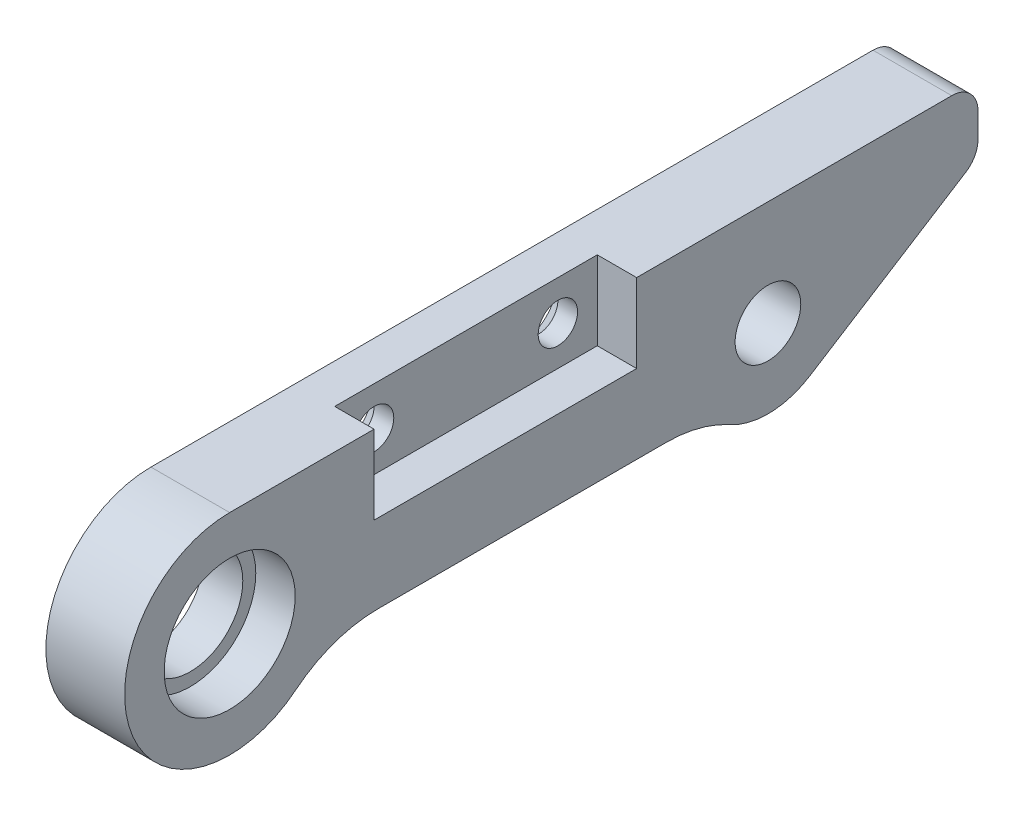
ISO-10303-21;
HEADER;
FILE_DESCRIPTION(('STEP AP214'),'2;1');
FILE_NAME('part.step','',(''),(''),'','','');
FILE_SCHEMA(('AUTOMOTIVE_DESIGN { 1 0 10303 214 1 1 1 1 }'));
ENDSEC;
DATA;
#1=APPLICATION_CONTEXT('core data for automotive mechanical design processes');
#2=APPLICATION_PROTOCOL_DEFINITION('international standard','automotive_design',2000,#1);
#3=PRODUCT_CONTEXT('',#1,'mechanical');
#4=PRODUCT('Part','Part','',(#3));
#5=PRODUCT_RELATED_PRODUCT_CATEGORY('part','',(#4));
#6=PRODUCT_DEFINITION_FORMATION('','',#4);
#7=PRODUCT_DEFINITION_CONTEXT('part definition',#1,'design');
#8=PRODUCT_DEFINITION('design','',#6,#7);
#9=PRODUCT_DEFINITION_SHAPE('','',#8);
#10=(LENGTH_UNIT() NAMED_UNIT(*) SI_UNIT(.MILLI.,.METRE.));
#11=(NAMED_UNIT(*) PLANE_ANGLE_UNIT() SI_UNIT($,.RADIAN.));
#12=(NAMED_UNIT(*) SI_UNIT($,.STERADIAN.) SOLID_ANGLE_UNIT());
#13=UNCERTAINTY_MEASURE_WITH_UNIT(LENGTH_MEASURE(1.E-05),#10,'distance_accuracy_value','');
#14=(GEOMETRIC_REPRESENTATION_CONTEXT(3) GLOBAL_UNCERTAINTY_ASSIGNED_CONTEXT((#13)) GLOBAL_UNIT_ASSIGNED_CONTEXT((#10,
#11,#12)) REPRESENTATION_CONTEXT('',''));
#15=CARTESIAN_POINT('',(0.,0.,0.));
#16=DIRECTION('',(0.,0.,1.));
#17=DIRECTION('',(1.,0.,0.));
#18=AXIS2_PLACEMENT_3D('',#15,#16,#17);
#19=CARTESIAN_POINT('',(6.,42.,-9.));
#20=DIRECTION('',(-1.,0.,0.));
#21=DIRECTION('',(0.,0.,1.));
#22=AXIS2_PLACEMENT_3D('',#19,#20,#21);
#23=CYLINDRICAL_SURFACE('',#22,4.);
#24=CARTESIAN_POINT('',(0.,42.,-9.));
#25=DIRECTION('',(1.,0.,0.));
#26=DIRECTION('',(0.,0.,-1.));
#27=AXIS2_PLACEMENT_3D('',#24,#25,#26);
#28=CIRCLE('',#27,4.);
#29=CARTESIAN_POINT('',(0.,42.,-13.));
#30=VERTEX_POINT('',#29);
#31=EDGE_CURVE('E180',#30,#30,#28,.T.);
#32=ORIENTED_EDGE('',*,*,#31,.F.);
#33=EDGE_LOOP('',(#32));
#34=FACE_BOUND('',#33,.T.);
#35=CARTESIAN_POINT('',(3.,42.,-9.));
#36=DIRECTION('',(1.,0.,0.));
#37=DIRECTION('',(0.,0.,-1.));
#38=AXIS2_PLACEMENT_3D('',#35,#36,#37);
#39=CIRCLE('',#38,4.);
#40=CARTESIAN_POINT('',(3.,42.,-13.));
#41=VERTEX_POINT('',#40);
#42=EDGE_CURVE('E192',#41,#41,#39,.T.);
#43=ORIENTED_EDGE('',*,*,#42,.T.);
#44=EDGE_LOOP('',(#43));
#45=FACE_BOUND('',#44,.T.);
#46=ADVANCED_FACE('F34',(#34,#45),#23,.F.);
#47=CARTESIAN_POINT('',(6.,42.,-9.));
#48=DIRECTION('',(1.,0.,0.));
#49=DIRECTION('',(0.,0.,-1.));
#50=AXIS2_PLACEMENT_3D('',#47,#48,#49);
#51=PLANE('',#50);
#52=CARTESIAN_POINT('',(6.,42.,-9.));
#53=DIRECTION('',(1.,0.,0.));
#54=DIRECTION('',(0.,0.,-1.));
#55=AXIS2_PLACEMENT_3D('',#52,#53,#54);
#56=CIRCLE('',#55,8.);
#57=CARTESIAN_POINT('',(6.,50.,-9.));
#58=VERTEX_POINT('',#57);
#59=CARTESIAN_POINT('',(6.,35.7777777777778,-14.0283148884377));
#60=VERTEX_POINT('',#59);
#61=EDGE_CURVE('E165',#58,#60,#56,.T.);
#62=ORIENTED_EDGE('',*,*,#61,.T.);
#63=CARTESIAN_POINT('',(6.,28.,-20.3137084989848));
#64=DIRECTION('',(1.,0.,0.));
#65=DIRECTION('',(0.,0.,1.));
#66=AXIS2_PLACEMENT_3D('',#63,#64,#65);
#67=CIRCLE('',#66,10.);
#68=CARTESIAN_POINT('',(6.,38.,-20.3137084989848));
#69=VERTEX_POINT('',#68);
#70=EDGE_CURVE('E376',#69,#60,#67,.T.);
#71=ORIENTED_EDGE('',*,*,#70,.F.);
#72=DIRECTION('',(0.,0.,1.));
#73=VECTOR('',#72,1.);
#74=CARTESIAN_POINT('',(6.,38.,-20.3137084989848));
#75=LINE('',#74,#73);
#76=CARTESIAN_POINT('',(6.,38.,-42.2540333075852));
#77=VERTEX_POINT('',#76);
#78=EDGE_CURVE('E384',#77,#69,#75,.T.);
#79=ORIENTED_EDGE('',*,*,#78,.F.);
#80=CARTESIAN_POINT('',(6.,28.,-42.2540333075852));
#81=DIRECTION('',(1.,0.,0.));
#82=DIRECTION('',(0.,0.,1.));
#83=AXIS2_PLACEMENT_3D('',#80,#81,#82);
#84=CIRCLE('',#83,10.);
#85=CARTESIAN_POINT('',(6.,36.75,-47.0952624903444));
#86=VERTEX_POINT('',#85);
#87=EDGE_CURVE('E157',#86,#77,#84,.T.);
#88=ORIENTED_EDGE('',*,*,#87,.F.);
#89=CARTESIAN_POINT('',(6.,42.,-50.));
#90=DIRECTION('',(-1.,0.,0.));
#91=DIRECTION('',(0.,0.,-1.));
#92=AXIS2_PLACEMENT_3D('',#89,#90,#91);
#93=CIRCLE('',#92,6.);
#94=CARTESIAN_POINT('',(6.,36.9254958066397,-53.2014695362551));
#95=VERTEX_POINT('',#94);
#96=EDGE_CURVE('E142',#95,#86,#93,.T.);
#97=ORIENTED_EDGE('',*,*,#96,.F.);
#98=DIRECTION('',(0.,0.533578256042508,-0.845750698893377));
#99=VECTOR('',#98,1.);
#100=CARTESIAN_POINT('',(6.,34.,-48.5643987878584));
#101=LINE('',#100,#99);
#102=CARTESIAN_POINT('',(6.,44.411475506797,-65.067156512085));
#103=VERTEX_POINT('',#102);
#104=EDGE_CURVE('E153',#95,#103,#101,.T.);
#105=ORIENTED_EDGE('',*,*,#104,.T.);
#106=CARTESIAN_POINT('',(6.,46.1029769045838,-64.));
#107=DIRECTION('',(1.,0.,0.));
#108=DIRECTION('',(0.,0.,-1.));
#109=AXIS2_PLACEMENT_3D('',#106,#107,#108);
#110=CIRCLE('',#109,2.);
#111=CARTESIAN_POINT('',(6.,46.1029769045838,-66.));
#112=VERTEX_POINT('',#111);
#113=EDGE_CURVE('E209',#103,#112,#110,.T.);
#114=ORIENTED_EDGE('',*,*,#113,.T.);
#115=DIRECTION('',(0.,1.,0.));
#116=VECTOR('',#115,1.);
#117=CARTESIAN_POINT('',(6.,50.,-66.));
#118=LINE('',#117,#116);
#119=CARTESIAN_POINT('',(6.,48.,-66.));
#120=VERTEX_POINT('',#119);
#121=EDGE_CURVE('E164',#112,#120,#118,.T.);
#122=ORIENTED_EDGE('',*,*,#121,.T.);
#123=CARTESIAN_POINT('',(6.,48.,-64.));
#124=DIRECTION('',(1.,0.,0.));
#125=DIRECTION('',(0.,0.,-1.));
#126=AXIS2_PLACEMENT_3D('',#123,#124,#125);
#127=CIRCLE('',#126,2.);
#128=CARTESIAN_POINT('',(6.,50.,-64.));
#129=VERTEX_POINT('',#128);
#130=EDGE_CURVE('E207',#120,#129,#127,.T.);
#131=ORIENTED_EDGE('',*,*,#130,.T.);
#132=DIRECTION('',(0.,0.,1.));
#133=VECTOR('',#132,1.);
#134=CARTESIAN_POINT('',(6.,50.,-9.));
#135=LINE('',#134,#133);
#136=CARTESIAN_POINT('',(6.,50.,-40.));
#137=VERTEX_POINT('',#136);
#138=EDGE_CURVE('E174',#129,#137,#135,.T.);
#139=ORIENTED_EDGE('',*,*,#138,.T.);
#140=DIRECTION('',(0.,1.,0.));
#141=VECTOR('',#140,1.);
#142=CARTESIAN_POINT('',(6.,44.,-40.));
#143=LINE('',#142,#141);
#144=CARTESIAN_POINT('',(6.,44.,-40.));
#145=VERTEX_POINT('',#144);
#146=EDGE_CURVE('E357',#145,#137,#143,.T.);
#147=ORIENTED_EDGE('',*,*,#146,.F.);
#148=DIRECTION('',(0.,0.,-1.));
#149=VECTOR('',#148,1.);
#150=CARTESIAN_POINT('',(6.,44.,-20.));
#151=LINE('',#150,#149);
#152=CARTESIAN_POINT('',(6.,44.,-20.));
#153=VERTEX_POINT('',#152);
#154=EDGE_CURVE('E346',#153,#145,#151,.T.);
#155=ORIENTED_EDGE('',*,*,#154,.F.);
#156=DIRECTION('',(0.,-1.,0.));
#157=VECTOR('',#156,1.);
#158=CARTESIAN_POINT('',(6.,44.,-20.));
#159=LINE('',#158,#157);
#160=CARTESIAN_POINT('',(6.,50.,-20.));
#161=VERTEX_POINT('',#160);
#162=EDGE_CURVE('E342',#161,#153,#159,.T.);
#163=ORIENTED_EDGE('',*,*,#162,.F.);
#164=EDGE_CURVE('E168',#161,#58,#135,.T.);
#165=ORIENTED_EDGE('',*,*,#164,.T.);
#166=EDGE_LOOP('',(#62,#71,#79,#88,#97,#105,#114,#122,#131,#139,#147,#155,#163,#165));
#167=FACE_BOUND('',#166,.T.);
#168=CARTESIAN_POINT('',(6.,42.,-9.));
#169=DIRECTION('',(1.,0.,0.));
#170=DIRECTION('',(0.,0.,-1.));
#171=AXIS2_PLACEMENT_3D('',#168,#169,#170);
#172=CIRCLE('',#171,4.99);
#173=CARTESIAN_POINT('',(6.,42.,-13.99));
#174=VERTEX_POINT('',#173);
#175=EDGE_CURVE('E254',#174,#174,#172,.T.);
#176=ORIENTED_EDGE('',*,*,#175,.F.);
#177=EDGE_LOOP('',(#176));
#178=FACE_BOUND('',#177,.T.);
#179=CARTESIAN_POINT('',(6.,42.,-50.));
#180=DIRECTION('',(1.,0.,0.));
#181=DIRECTION('',(0.,0.,-1.));
#182=AXIS2_PLACEMENT_3D('',#179,#180,#181);
#183=CIRCLE('',#182,2.5);
#184=CARTESIAN_POINT('',(6.,42.,-52.5));
#185=VERTEX_POINT('',#184);
#186=EDGE_CURVE('E265',#185,#185,#183,.T.);
#187=ORIENTED_EDGE('',*,*,#186,.F.);
#188=EDGE_LOOP('',(#187));
#189=FACE_BOUND('',#188,.T.);
#190=ADVANCED_FACE('F151',(#167,#178,#189),#51,.T.);
#191=CARTESIAN_POINT('',(0.,42.,-9.));
#192=DIRECTION('',(1.,0.,0.));
#193=DIRECTION('',(0.,0.,-1.));
#194=AXIS2_PLACEMENT_3D('',#191,#192,#193);
#195=PLANE('',#194);
#196=ORIENTED_EDGE('',*,*,#31,.T.);
#197=EDGE_LOOP('',(#196));
#198=FACE_BOUND('',#197,.T.);
#199=DIRECTION('',(0.,0.,1.));
#200=VECTOR('',#199,1.);
#201=CARTESIAN_POINT('',(0.,50.,-9.));
#202=LINE('',#201,#200);
#203=CARTESIAN_POINT('',(0.,50.,-23.));
#204=VERTEX_POINT('',#203);
#205=CARTESIAN_POINT('',(0.,50.,-9.));
#206=VERTEX_POINT('',#205);
#207=EDGE_CURVE('E185',#204,#206,#202,.T.);
#208=ORIENTED_EDGE('',*,*,#207,.F.);
#209=CARTESIAN_POINT('',(0.,47.,-23.));
#210=DIRECTION('',(1.,0.,0.));
#211=DIRECTION('',(0.,0.,-1.));
#212=AXIS2_PLACEMENT_3D('',#209,#210,#211);
#213=CIRCLE('',#212,3.00000000000007);
#214=EDGE_CURVE('E42',#204,#204,#213,.T.);
#215=ORIENTED_EDGE('',*,*,#214,.T.);
#216=CARTESIAN_POINT('',(0.,50.,-37.));
#217=VERTEX_POINT('',#216);
#218=EDGE_CURVE('E188',#217,#204,#202,.T.);
#219=ORIENTED_EDGE('',*,*,#218,.F.);
#220=CARTESIAN_POINT('',(0.,47.,-37.));
#221=DIRECTION('',(1.,0.,0.));
#222=DIRECTION('',(0.,0.,-1.));
#223=AXIS2_PLACEMENT_3D('',#220,#221,#222);
#224=CIRCLE('',#223,3.00000000000007);
#225=EDGE_CURVE('E51',#217,#217,#224,.T.);
#226=ORIENTED_EDGE('',*,*,#225,.T.);
#227=CARTESIAN_POINT('',(0.,50.,-64.));
#228=VERTEX_POINT('',#227);
#229=EDGE_CURVE('E170',#228,#217,#202,.T.);
#230=ORIENTED_EDGE('',*,*,#229,.F.);
#231=CARTESIAN_POINT('',(0.,48.,-64.));
#232=DIRECTION('',(1.,0.,0.));
#233=DIRECTION('',(0.,0.,-1.));
#234=AXIS2_PLACEMENT_3D('',#231,#232,#233);
#235=CIRCLE('',#234,2.);
#236=CARTESIAN_POINT('',(0.,48.,-66.));
#237=VERTEX_POINT('',#236);
#238=EDGE_CURVE('E201',#228,#237,#235,.F.);
#239=ORIENTED_EDGE('',*,*,#238,.T.);
#240=DIRECTION('',(0.,1.,0.));
#241=VECTOR('',#240,1.);
#242=CARTESIAN_POINT('',(0.,50.,-66.));
#243=LINE('',#242,#241);
#244=CARTESIAN_POINT('',(0.,46.1029769045838,-66.));
#245=VERTEX_POINT('',#244);
#246=EDGE_CURVE('E182',#245,#237,#243,.T.);
#247=ORIENTED_EDGE('',*,*,#246,.F.);
#248=CARTESIAN_POINT('',(0.,46.1029769045838,-64.));
#249=DIRECTION('',(1.,0.,0.));
#250=DIRECTION('',(0.,0.,-1.));
#251=AXIS2_PLACEMENT_3D('',#248,#249,#250);
#252=CIRCLE('',#251,2.);
#253=CARTESIAN_POINT('',(0.,44.411475506797,-65.067156512085));
#254=VERTEX_POINT('',#253);
#255=EDGE_CURVE('E203',#245,#254,#252,.F.);
#256=ORIENTED_EDGE('',*,*,#255,.T.);
#257=DIRECTION('',(0.,0.533578256042508,-0.845750698893377));
#258=VECTOR('',#257,1.);
#259=CARTESIAN_POINT('',(0.,34.,-48.5643987878584));
#260=LINE('',#259,#258);
#261=CARTESIAN_POINT('',(0.,36.9254958066397,-53.2014695362551));
#262=VERTEX_POINT('',#261);
#263=EDGE_CURVE('E179',#262,#254,#260,.T.);
#264=ORIENTED_EDGE('',*,*,#263,.F.);
#265=CARTESIAN_POINT('',(0.,42.,-50.));
#266=DIRECTION('',(1.,0.,0.));
#267=DIRECTION('',(0.,0.,-1.));
#268=AXIS2_PLACEMENT_3D('',#265,#266,#267);
#269=CIRCLE('',#268,6.);
#270=CARTESIAN_POINT('',(0.,36.75,-47.0952624903444));
#271=VERTEX_POINT('',#270);
#272=EDGE_CURVE('E145',#271,#262,#269,.T.);
#273=ORIENTED_EDGE('',*,*,#272,.F.);
#274=CARTESIAN_POINT('',(0.,28.,-42.2540333075852));
#275=DIRECTION('',(1.,0.,0.));
#276=DIRECTION('',(0.,0.,-1.));
#277=AXIS2_PLACEMENT_3D('',#274,#275,#276);
#278=CIRCLE('',#277,10.);
#279=CARTESIAN_POINT('',(0.,38.,-42.2540333075852));
#280=VERTEX_POINT('',#279);
#281=EDGE_CURVE('E401',#280,#271,#278,.F.);
#282=ORIENTED_EDGE('',*,*,#281,.F.);
#283=DIRECTION('',(0.,0.,-1.));
#284=VECTOR('',#283,1.);
#285=CARTESIAN_POINT('',(0.,38.,-20.3137084989848));
#286=LINE('',#285,#284);
#287=CARTESIAN_POINT('',(0.,38.,-20.3137084989848));
#288=VERTEX_POINT('',#287);
#289=EDGE_CURVE('E395',#288,#280,#286,.T.);
#290=ORIENTED_EDGE('',*,*,#289,.F.);
#291=CARTESIAN_POINT('',(0.,28.,-20.3137084989848));
#292=DIRECTION('',(1.,0.,0.));
#293=DIRECTION('',(0.,0.,-1.));
#294=AXIS2_PLACEMENT_3D('',#291,#292,#293);
#295=CIRCLE('',#294,10.);
#296=CARTESIAN_POINT('',(0.,35.7777777777778,-14.0283148884377));
#297=VERTEX_POINT('',#296);
#298=EDGE_CURVE('E158',#297,#288,#295,.F.);
#299=ORIENTED_EDGE('',*,*,#298,.F.);
#300=CARTESIAN_POINT('',(0.,42.,-9.));
#301=DIRECTION('',(1.,0.,0.));
#302=DIRECTION('',(0.,0.,-1.));
#303=AXIS2_PLACEMENT_3D('',#300,#301,#302);
#304=CIRCLE('',#303,8.);
#305=EDGE_CURVE('E177',#206,#297,#304,.T.);
#306=ORIENTED_EDGE('',*,*,#305,.F.);
#307=EDGE_LOOP('',(#208,#215,#219,#226,#230,#239,#247,#256,#264,#273,#282,#290,#299,#306));
#308=FACE_BOUND('',#307,.T.);
#309=CARTESIAN_POINT('',(0.,42.,-50.));
#310=DIRECTION('',(1.,0.,0.));
#311=DIRECTION('',(0.,0.,-1.));
#312=AXIS2_PLACEMENT_3D('',#309,#310,#311);
#313=CIRCLE('',#312,2.5);
#314=CARTESIAN_POINT('',(0.,42.,-52.5));
#315=VERTEX_POINT('',#314);
#316=EDGE_CURVE('E195',#315,#315,#313,.T.);
#317=ORIENTED_EDGE('',*,*,#316,.T.);
#318=EDGE_LOOP('',(#317));
#319=FACE_BOUND('',#318,.T.);
#320=ADVANCED_FACE('F220',(#198,#308,#319),#195,.F.);
#321=CARTESIAN_POINT('',(6.,42.,-9.));
#322=DIRECTION('',(-1.,0.,0.));
#323=DIRECTION('',(0.,0.,1.));
#324=AXIS2_PLACEMENT_3D('',#321,#322,#323);
#325=CYLINDRICAL_SURFACE('',#324,8.);
#326=ORIENTED_EDGE('',*,*,#305,.T.);
#327=DIRECTION('',(1.,0.,0.));
#328=VECTOR('',#327,1.);
#329=CARTESIAN_POINT('',(-0.00100000000000013,35.7777777777778,-14.0283148884377));
#330=LINE('',#329,#328);
#331=EDGE_CURVE('E349',#297,#60,#330,.T.);
#332=ORIENTED_EDGE('',*,*,#331,.T.);
#333=ORIENTED_EDGE('',*,*,#61,.F.);
#334=DIRECTION('',(-1.,0.,0.));
#335=VECTOR('',#334,1.);
#336=CARTESIAN_POINT('',(6.,50.,-9.));
#337=LINE('',#336,#335);
#338=EDGE_CURVE('E176',#58,#206,#337,.T.);
#339=ORIENTED_EDGE('',*,*,#338,.T.);
#340=EDGE_LOOP('',(#326,#332,#333,#339));
#341=FACE_BOUND('',#340,.T.);
#342=ADVANCED_FACE('F301',(#341),#325,.T.);
#343=CARTESIAN_POINT('',(6.,34.,-48.5643987878584));
#344=DIRECTION('',(0.,0.845750698893377,0.533578256042508));
#345=DIRECTION('',(0.,-0.533578256042508,0.845750698893377));
#346=AXIS2_PLACEMENT_3D('',#343,#344,#345);
#347=PLANE('',#346);
#348=ORIENTED_EDGE('',*,*,#104,.F.);
#349=DIRECTION('',(1.,0.,0.));
#350=VECTOR('',#349,1.);
#351=CARTESIAN_POINT('',(-0.00100000000000013,36.9254958066397,-53.2014695362551));
#352=LINE('',#351,#350);
#353=EDGE_CURVE('E138',#262,#95,#352,.T.);
#354=ORIENTED_EDGE('',*,*,#353,.F.);
#355=ORIENTED_EDGE('',*,*,#263,.T.);
#356=DIRECTION('',(-1.,0.,0.));
#357=VECTOR('',#356,1.);
#358=CARTESIAN_POINT('',(6.,44.411475506797,-65.067156512085));
#359=LINE('',#358,#357);
#360=EDGE_CURVE('E162',#254,#103,#359,.F.);
#361=ORIENTED_EDGE('',*,*,#360,.T.);
#362=EDGE_LOOP('',(#348,#354,#355,#361));
#363=FACE_BOUND('',#362,.T.);
#364=ADVANCED_FACE('F160',(#363),#347,.F.);
#365=CARTESIAN_POINT('',(6.,50.,-66.));
#366=DIRECTION('',(0.,0.,1.));
#367=DIRECTION('',(0.,-1.,0.));
#368=AXIS2_PLACEMENT_3D('',#365,#366,#367);
#369=PLANE('',#368);
#370=ORIENTED_EDGE('',*,*,#121,.F.);
#371=DIRECTION('',(-1.,0.,0.));
#372=VECTOR('',#371,1.);
#373=CARTESIAN_POINT('',(6.,46.1029769045838,-66.));
#374=LINE('',#373,#372);
#375=EDGE_CURVE('E198',#112,#245,#374,.T.);
#376=ORIENTED_EDGE('',*,*,#375,.T.);
#377=ORIENTED_EDGE('',*,*,#246,.T.);
#378=DIRECTION('',(-1.,0.,0.));
#379=VECTOR('',#378,1.);
#380=CARTESIAN_POINT('',(6.,48.,-66.));
#381=LINE('',#380,#379);
#382=EDGE_CURVE('E191',#237,#120,#381,.F.);
#383=ORIENTED_EDGE('',*,*,#382,.T.);
#384=EDGE_LOOP('',(#370,#376,#377,#383));
#385=FACE_BOUND('',#384,.T.);
#386=ADVANCED_FACE('F236',(#385),#369,.F.);
#387=CARTESIAN_POINT('',(6.,50.,-9.));
#388=DIRECTION('',(0.,-1.,0.));
#389=DIRECTION('',(0.,0.,-1.));
#390=AXIS2_PLACEMENT_3D('',#387,#388,#389);
#391=PLANE('',#390);
#392=ORIENTED_EDGE('',*,*,#138,.F.);
#393=DIRECTION('',(-1.,0.,0.));
#394=VECTOR('',#393,1.);
#395=CARTESIAN_POINT('',(6.,50.,-64.));
#396=LINE('',#395,#394);
#397=EDGE_CURVE('E211',#129,#228,#396,.T.);
#398=ORIENTED_EDGE('',*,*,#397,.T.);
#399=ORIENTED_EDGE('',*,*,#229,.T.);
#400=ORIENTED_EDGE('',*,*,#218,.T.);
#401=ORIENTED_EDGE('',*,*,#207,.T.);
#402=ORIENTED_EDGE('',*,*,#338,.F.);
#403=ORIENTED_EDGE('',*,*,#164,.F.);
#404=DIRECTION('',(1.,0.,0.));
#405=VECTOR('',#404,1.);
#406=CARTESIAN_POINT('',(3.,50.,-20.));
#407=LINE('',#406,#405);
#408=CARTESIAN_POINT('',(3.,50.,-20.));
#409=VERTEX_POINT('',#408);
#410=EDGE_CURVE('E251',#409,#161,#407,.T.);
#411=ORIENTED_EDGE('',*,*,#410,.F.);
#412=DIRECTION('',(0.,0.,1.));
#413=VECTOR('',#412,1.);
#414=CARTESIAN_POINT('',(3.,50.,-20.));
#415=LINE('',#414,#413);
#416=CARTESIAN_POINT('',(3.,50.,-40.));
#417=VERTEX_POINT('',#416);
#418=EDGE_CURVE('E248',#417,#409,#415,.T.);
#419=ORIENTED_EDGE('',*,*,#418,.F.);
#420=DIRECTION('',(1.,0.,0.));
#421=VECTOR('',#420,1.);
#422=CARTESIAN_POINT('',(3.,50.,-40.));
#423=LINE('',#422,#421);
#424=EDGE_CURVE('E245',#417,#137,#423,.T.);
#425=ORIENTED_EDGE('',*,*,#424,.T.);
#426=EDGE_LOOP('',(#392,#398,#399,#400,#401,#402,#403,#411,#419,#425));
#427=FACE_BOUND('',#426,.T.);
#428=ADVANCED_FACE('F228',(#427),#391,.F.);
#429=CARTESIAN_POINT('',(6.,42.,-50.));
#430=DIRECTION('',(-1.,0.,0.));
#431=DIRECTION('',(0.,0.,1.));
#432=AXIS2_PLACEMENT_3D('',#429,#430,#431);
#433=CYLINDRICAL_SURFACE('',#432,2.5);
#434=ORIENTED_EDGE('',*,*,#186,.T.);
#435=EDGE_LOOP('',(#434));
#436=FACE_BOUND('',#435,.T.);
#437=ORIENTED_EDGE('',*,*,#316,.F.);
#438=EDGE_LOOP('',(#437));
#439=FACE_BOUND('',#438,.T.);
#440=ADVANCED_FACE('F288',(#436,#439),#433,.F.);
#441=CARTESIAN_POINT('',(3.,42.,-9.));
#442=DIRECTION('',(1.,0.,0.));
#443=DIRECTION('',(0.,0.,-1.));
#444=AXIS2_PLACEMENT_3D('',#441,#442,#443);
#445=CYLINDRICAL_SURFACE('',#444,4.99);
#446=CARTESIAN_POINT('',(3.,42.,-9.));
#447=DIRECTION('',(1.,0.,0.));
#448=DIRECTION('',(0.,0.,-1.));
#449=AXIS2_PLACEMENT_3D('',#446,#447,#448);
#450=CIRCLE('',#449,4.99);
#451=CARTESIAN_POINT('',(3.,42.,-13.99));
#452=VERTEX_POINT('',#451);
#453=EDGE_CURVE('E196',#452,#452,#450,.T.);
#454=ORIENTED_EDGE('',*,*,#453,.F.);
#455=EDGE_LOOP('',(#454));
#456=FACE_BOUND('',#455,.T.);
#457=ORIENTED_EDGE('',*,*,#175,.T.);
#458=EDGE_LOOP('',(#457));
#459=FACE_BOUND('',#458,.T.);
#460=ADVANCED_FACE('F282',(#456,#459),#445,.F.);
#461=CARTESIAN_POINT('',(3.,42.,-9.));
#462=DIRECTION('',(1.,0.,0.));
#463=DIRECTION('',(0.,0.,-1.));
#464=AXIS2_PLACEMENT_3D('',#461,#462,#463);
#465=PLANE('',#464);
#466=ORIENTED_EDGE('',*,*,#42,.F.);
#467=EDGE_LOOP('',(#466));
#468=FACE_BOUND('',#467,.T.);
#469=ORIENTED_EDGE('',*,*,#453,.T.);
#470=EDGE_LOOP('',(#469));
#471=FACE_BOUND('',#470,.T.);
#472=ADVANCED_FACE('F278',(#468,#471),#465,.T.);
#473=CARTESIAN_POINT('',(3.,44.,-20.));
#474=DIRECTION('',(0.,0.,1.));
#475=DIRECTION('',(1.,0.,0.));
#476=AXIS2_PLACEMENT_3D('',#473,#474,#475);
#477=PLANE('',#476);
#478=ORIENTED_EDGE('',*,*,#162,.T.);
#479=DIRECTION('',(1.,0.,0.));
#480=VECTOR('',#479,1.);
#481=CARTESIAN_POINT('',(3.,44.,-20.));
#482=LINE('',#481,#480);
#483=CARTESIAN_POINT('',(3.,44.,-20.));
#484=VERTEX_POINT('',#483);
#485=EDGE_CURVE('E256',#484,#153,#482,.T.);
#486=ORIENTED_EDGE('',*,*,#485,.F.);
#487=DIRECTION('',(0.,-1.,0.));
#488=VECTOR('',#487,1.);
#489=CARTESIAN_POINT('',(3.,44.,-20.));
#490=LINE('',#489,#488);
#491=EDGE_CURVE('E353',#409,#484,#490,.T.);
#492=ORIENTED_EDGE('',*,*,#491,.F.);
#493=ORIENTED_EDGE('',*,*,#410,.T.);
#494=EDGE_LOOP('',(#478,#486,#492,#493));
#495=FACE_BOUND('',#494,.T.);
#496=ADVANCED_FACE('F281',(#495),#477,.F.);
#497=CARTESIAN_POINT('',(3.,44.,-40.));
#498=DIRECTION('',(0.,0.,-1.));
#499=DIRECTION('',(-1.,0.,0.));
#500=AXIS2_PLACEMENT_3D('',#497,#498,#499);
#501=PLANE('',#500);
#502=ORIENTED_EDGE('',*,*,#146,.T.);
#503=ORIENTED_EDGE('',*,*,#424,.F.);
#504=DIRECTION('',(0.,1.,0.));
#505=VECTOR('',#504,1.);
#506=CARTESIAN_POINT('',(3.,44.,-40.));
#507=LINE('',#506,#505);
#508=CARTESIAN_POINT('',(3.,44.,-40.));
#509=VERTEX_POINT('',#508);
#510=EDGE_CURVE('E360',#509,#417,#507,.T.);
#511=ORIENTED_EDGE('',*,*,#510,.F.);
#512=DIRECTION('',(1.,0.,0.));
#513=VECTOR('',#512,1.);
#514=CARTESIAN_POINT('',(3.,44.,-40.));
#515=LINE('',#514,#513);
#516=EDGE_CURVE('E252',#509,#145,#515,.T.);
#517=ORIENTED_EDGE('',*,*,#516,.T.);
#518=EDGE_LOOP('',(#502,#503,#511,#517));
#519=FACE_BOUND('',#518,.T.);
#520=ADVANCED_FACE('F364',(#519),#501,.F.);
#521=CARTESIAN_POINT('',(3.,44.,-20.));
#522=DIRECTION('',(0.,-1.,0.));
#523=DIRECTION('',(0.,0.,-1.));
#524=AXIS2_PLACEMENT_3D('',#521,#522,#523);
#525=PLANE('',#524);
#526=ORIENTED_EDGE('',*,*,#154,.T.);
#527=ORIENTED_EDGE('',*,*,#516,.F.);
#528=DIRECTION('',(0.,0.,-1.));
#529=VECTOR('',#528,1.);
#530=CARTESIAN_POINT('',(3.,44.,-20.));
#531=LINE('',#530,#529);
#532=EDGE_CURVE('E356',#484,#509,#531,.T.);
#533=ORIENTED_EDGE('',*,*,#532,.F.);
#534=ORIENTED_EDGE('',*,*,#485,.T.);
#535=EDGE_LOOP('',(#526,#527,#533,#534));
#536=FACE_BOUND('',#535,.T.);
#537=ADVANCED_FACE('F369',(#536),#525,.F.);
#538=CARTESIAN_POINT('',(3.,0.,0.));
#539=DIRECTION('',(-1.,0.,0.));
#540=DIRECTION('',(0.,0.,1.));
#541=AXIS2_PLACEMENT_3D('',#538,#539,#540);
#542=PLANE('',#541);
#543=CARTESIAN_POINT('',(3.,47.,-37.));
#544=DIRECTION('',(1.,0.,0.));
#545=DIRECTION('',(0.,0.,-1.));
#546=AXIS2_PLACEMENT_3D('',#543,#544,#545);
#547=CIRCLE('',#546,1.5);
#548=CARTESIAN_POINT('',(3.,47.,-38.5));
#549=VERTEX_POINT('',#548);
#550=EDGE_CURVE('E343',#549,#549,#547,.T.);
#551=ORIENTED_EDGE('',*,*,#550,.F.);
#552=EDGE_LOOP('',(#551));
#553=FACE_BOUND('',#552,.T.);
#554=CARTESIAN_POINT('',(3.,47.,-23.));
#555=DIRECTION('',(1.,0.,0.));
#556=DIRECTION('',(0.,0.,-1.));
#557=AXIS2_PLACEMENT_3D('',#554,#555,#556);
#558=CIRCLE('',#557,1.5);
#559=CARTESIAN_POINT('',(3.,47.,-24.5));
#560=VERTEX_POINT('',#559);
#561=EDGE_CURVE('E340',#560,#560,#558,.T.);
#562=ORIENTED_EDGE('',*,*,#561,.F.);
#563=EDGE_LOOP('',(#562));
#564=FACE_BOUND('',#563,.T.);
#565=ORIENTED_EDGE('',*,*,#491,.T.);
#566=ORIENTED_EDGE('',*,*,#532,.T.);
#567=ORIENTED_EDGE('',*,*,#510,.T.);
#568=ORIENTED_EDGE('',*,*,#418,.T.);
#569=EDGE_LOOP('',(#565,#566,#567,#568));
#570=FACE_BOUND('',#569,.T.);
#571=ADVANCED_FACE('F336',(#553,#564,#570),#542,.F.);
#572=CARTESIAN_POINT('',(-0.00100000000000013,47.,-23.));
#573=DIRECTION('',(1.,0.,0.));
#574=DIRECTION('',(0.,0.,-1.));
#575=AXIS2_PLACEMENT_3D('',#572,#573,#574);
#576=CYLINDRICAL_SURFACE('',#575,1.5);
#577=CARTESIAN_POINT('',(1.50000000000006,47.,-23.));
#578=DIRECTION('',(1.,0.,0.));
#579=DIRECTION('',(0.,0.,-1.));
#580=AXIS2_PLACEMENT_3D('',#577,#578,#579);
#581=CIRCLE('',#580,1.5);
#582=CARTESIAN_POINT('',(1.50000000000006,47.,-24.5));
#583=VERTEX_POINT('',#582);
#584=EDGE_CURVE('E214',#583,#583,#581,.F.);
#585=CARTESIAN_POINT('',(1.50000000000006,47.,-24.5));
#586=CARTESIAN_POINT('',(1.51562500000005,47.,-24.5));
#587=CARTESIAN_POINT('',(1.53125000000005,47.,-24.5));
#588=CARTESIAN_POINT('',(1.56250000000005,47.,-24.5));
#589=CARTESIAN_POINT('',(1.57812500000005,47.,-24.5));
#590=CARTESIAN_POINT('',(1.60937500000005,47.,-24.5));
#591=CARTESIAN_POINT('',(1.62500000000005,47.,-24.5));
#592=CARTESIAN_POINT('',(1.65625000000005,47.,-24.5));
#593=CARTESIAN_POINT('',(1.67187500000005,47.,-24.5));
#594=CARTESIAN_POINT('',(1.70312500000005,47.,-24.5));
#595=CARTESIAN_POINT('',(1.71875000000005,47.,-24.5));
#596=CARTESIAN_POINT('',(1.75000000000005,47.,-24.5));
#597=CARTESIAN_POINT('',(1.76562500000005,47.,-24.5));
#598=CARTESIAN_POINT('',(1.79687500000004,47.,-24.5));
#599=CARTESIAN_POINT('',(1.81250000000004,47.,-24.5));
#600=CARTESIAN_POINT('',(1.84375000000004,47.,-24.5));
#601=CARTESIAN_POINT('',(1.85937500000004,47.,-24.5));
#602=CARTESIAN_POINT('',(1.89062500000004,47.,-24.5));
#603=CARTESIAN_POINT('',(1.90625000000004,47.,-24.5));
#604=CARTESIAN_POINT('',(1.93750000000004,47.,-24.5));
#605=CARTESIAN_POINT('',(1.95312500000004,47.,-24.5));
#606=CARTESIAN_POINT('',(1.98437500000004,47.,-24.5));
#607=CARTESIAN_POINT('',(2.00000000000004,47.,-24.5));
#608=CARTESIAN_POINT('',(2.03125000000004,47.,-24.5));
#609=CARTESIAN_POINT('',(2.04687500000003,47.,-24.5));
#610=CARTESIAN_POINT('',(2.07812500000003,47.,-24.5));
#611=CARTESIAN_POINT('',(2.09375000000003,47.,-24.5));
#612=CARTESIAN_POINT('',(2.12500000000003,47.,-24.5));
#613=CARTESIAN_POINT('',(2.14062500000003,47.,-24.5));
#614=CARTESIAN_POINT('',(2.17187500000003,47.,-24.5));
#615=CARTESIAN_POINT('',(2.18750000000003,47.,-24.5));
#616=CARTESIAN_POINT('',(2.21875000000003,47.,-24.5));
#617=CARTESIAN_POINT('',(2.23437500000003,47.,-24.5));
#618=CARTESIAN_POINT('',(2.26562500000003,47.,-24.5));
#619=CARTESIAN_POINT('',(2.28125000000003,47.,-24.5));
#620=CARTESIAN_POINT('',(2.31250000000002,47.,-24.5));
#621=CARTESIAN_POINT('',(2.32812500000002,47.,-24.5));
#622=CARTESIAN_POINT('',(2.35937500000002,47.,-24.5));
#623=CARTESIAN_POINT('',(2.37500000000002,47.,-24.5));
#624=CARTESIAN_POINT('',(2.40625000000002,47.,-24.5));
#625=CARTESIAN_POINT('',(2.42187500000002,47.,-24.5));
#626=CARTESIAN_POINT('',(2.45312500000002,47.,-24.5));
#627=CARTESIAN_POINT('',(2.46875000000002,47.,-24.5));
#628=CARTESIAN_POINT('',(2.50000000000002,47.,-24.5));
#629=CARTESIAN_POINT('',(2.51562500000002,47.,-24.5));
#630=CARTESIAN_POINT('',(2.54687500000002,47.,-24.5));
#631=CARTESIAN_POINT('',(2.56250000000002,47.,-24.5));
#632=CARTESIAN_POINT('',(2.59375000000002,47.,-24.5));
#633=CARTESIAN_POINT('',(2.60937500000001,47.,-24.5));
#634=CARTESIAN_POINT('',(2.64062500000001,47.,-24.5));
#635=CARTESIAN_POINT('',(2.65625000000001,47.,-24.5));
#636=CARTESIAN_POINT('',(2.68750000000001,47.,-24.5));
#637=CARTESIAN_POINT('',(2.70312500000001,47.,-24.5));
#638=CARTESIAN_POINT('',(2.73437500000001,47.,-24.5));
#639=CARTESIAN_POINT('',(2.75000000000001,47.,-24.5));
#640=CARTESIAN_POINT('',(2.78125000000001,47.,-24.5));
#641=CARTESIAN_POINT('',(2.79687500000001,47.,-24.5));
#642=CARTESIAN_POINT('',(2.82812500000001,47.,-24.5));
#643=CARTESIAN_POINT('',(2.84375000000001,47.,-24.5));
#644=CARTESIAN_POINT('',(2.875,47.,-24.5));
#645=CARTESIAN_POINT('',(2.890625,47.,-24.5));
#646=CARTESIAN_POINT('',(2.921875,47.,-24.5));
#647=CARTESIAN_POINT('',(2.9375,47.,-24.5));
#648=CARTESIAN_POINT('',(2.96875,47.,-24.5));
#649=CARTESIAN_POINT('',(2.984375,47.,-24.5));
#650=CARTESIAN_POINT('',(3.,47.,-24.5));
#651=B_SPLINE_CURVE_WITH_KNOTS('',3,(#585,#586,#587,#588,#589,#590,#591,#592,#593,#594,#595,
#596,#597,#598,#599,#600,#601,#602,#603,#604,#605,#606,#607,#608,#609,#610,#611,#612,#613,#614,
#615,#616,#617,#618,#619,#620,#621,#622,#623,#624,#625,#626,#627,#628,#629,#630,#631,#632,#633,
#634,#635,#636,#637,#638,#639,#640,#641,#642,#643,#644,#645,#646,#647,#648,#649,#650),
.UNSPECIFIED.,.F.,.F.,(4,2,2,2,2,2,2,2,2,2,2,2,2,2,2,2,2,2,2,2,2,2,2,2,2,2,2,2,2,2,2,2,4),(0.,
0.0468749999999983,0.0937499999999966,0.140624999999995,0.187499999999993,0.234374999999991,
0.28124999999999,0.328124999999988,0.374999999999986,0.421874999999984,0.468749999999982,
0.515624999999981,0.562499999999979,0.609374999999977,0.656249999999976,0.703124999999974,
0.749999999999972,0.796874999999971,0.843749999999968,0.890624999999967,0.937499999999965,
0.984374999999963,1.03124999999996,1.07812499999996,1.12499999999996,1.17187499999996,
1.21874999999995,1.26562499999995,1.31249999999995,1.35937499999995,1.40624999999995,
1.45312499999995,1.49999999999994),.UNSPECIFIED.);
#652=EDGE_CURVE('BSEAM333',#583,#560,#651,.T.);
#653=ORIENTED_EDGE('',*,*,#584,.T.);
#654=ORIENTED_EDGE('',*,*,#561,.T.);
#655=ORIENTED_EDGE('',*,*,#652,.T.);
#656=ORIENTED_EDGE('',*,*,#652,.F.);
#657=EDGE_LOOP('',(#653,#655,#654,#656));
#658=FACE_BOUND('',#657,.T.);
#659=ADVANCED_FACE('F333',(#658),#576,.F.);
#660=CARTESIAN_POINT('',(-0.00100000000000013,47.,-37.));
#661=DIRECTION('',(1.,0.,0.));
#662=DIRECTION('',(0.,0.,-1.));
#663=AXIS2_PLACEMENT_3D('',#660,#661,#662);
#664=CYLINDRICAL_SURFACE('',#663,1.5);
#665=CARTESIAN_POINT('',(1.50000000000005,47.,-37.));
#666=DIRECTION('',(1.,0.,0.));
#667=DIRECTION('',(0.,0.,-1.));
#668=AXIS2_PLACEMENT_3D('',#665,#666,#667);
#669=CIRCLE('',#668,1.5);
#670=CARTESIAN_POINT('',(1.50000000000005,47.,-38.5));
#671=VERTEX_POINT('',#670);
#672=EDGE_CURVE('E11',#671,#671,#669,.F.);
#673=CARTESIAN_POINT('',(1.50000000000005,47.,-38.5));
#674=CARTESIAN_POINT('',(1.51562500000005,47.,-38.5));
#675=CARTESIAN_POINT('',(1.53125000000005,47.,-38.5));
#676=CARTESIAN_POINT('',(1.56250000000005,47.,-38.5));
#677=CARTESIAN_POINT('',(1.57812500000005,47.,-38.5));
#678=CARTESIAN_POINT('',(1.60937500000005,47.,-38.5));
#679=CARTESIAN_POINT('',(1.62500000000005,47.,-38.5));
#680=CARTESIAN_POINT('',(1.65625000000005,47.,-38.5));
#681=CARTESIAN_POINT('',(1.67187500000005,47.,-38.5));
#682=CARTESIAN_POINT('',(1.70312500000005,47.,-38.5));
#683=CARTESIAN_POINT('',(1.71875000000004,47.,-38.5));
#684=CARTESIAN_POINT('',(1.75000000000004,47.,-38.5));
#685=CARTESIAN_POINT('',(1.76562500000004,47.,-38.5));
#686=CARTESIAN_POINT('',(1.79687500000004,47.,-38.5));
#687=CARTESIAN_POINT('',(1.81250000000004,47.,-38.5));
#688=CARTESIAN_POINT('',(1.84375000000004,47.,-38.5));
#689=CARTESIAN_POINT('',(1.85937500000004,47.,-38.5));
#690=CARTESIAN_POINT('',(1.89062500000004,47.,-38.5));
#691=CARTESIAN_POINT('',(1.90625000000004,47.,-38.5));
#692=CARTESIAN_POINT('',(1.93750000000004,47.,-38.5));
#693=CARTESIAN_POINT('',(1.95312500000004,47.,-38.5));
#694=CARTESIAN_POINT('',(1.98437500000004,47.,-38.5));
#695=CARTESIAN_POINT('',(2.00000000000003,47.,-38.5));
#696=CARTESIAN_POINT('',(2.03125000000003,47.,-38.5));
#697=CARTESIAN_POINT('',(2.04687500000003,47.,-38.5));
#698=CARTESIAN_POINT('',(2.07812500000003,47.,-38.5));
#699=CARTESIAN_POINT('',(2.09375000000003,47.,-38.5));
#700=CARTESIAN_POINT('',(2.12500000000003,47.,-38.5));
#701=CARTESIAN_POINT('',(2.14062500000003,47.,-38.5));
#702=CARTESIAN_POINT('',(2.17187500000003,47.,-38.5));
#703=CARTESIAN_POINT('',(2.18750000000003,47.,-38.5));
#704=CARTESIAN_POINT('',(2.21875000000003,47.,-38.5));
#705=CARTESIAN_POINT('',(2.23437500000003,47.,-38.5));
#706=CARTESIAN_POINT('',(2.26562500000003,47.,-38.5));
#707=CARTESIAN_POINT('',(2.28125000000002,47.,-38.5));
#708=CARTESIAN_POINT('',(2.31250000000002,47.,-38.5));
#709=CARTESIAN_POINT('',(2.32812500000002,47.,-38.5));
#710=CARTESIAN_POINT('',(2.35937500000002,47.,-38.5));
#711=CARTESIAN_POINT('',(2.37500000000002,47.,-38.5));
#712=CARTESIAN_POINT('',(2.40625000000002,47.,-38.5));
#713=CARTESIAN_POINT('',(2.42187500000002,47.,-38.5));
#714=CARTESIAN_POINT('',(2.45312500000002,47.,-38.5));
#715=CARTESIAN_POINT('',(2.46875000000002,47.,-38.5));
#716=CARTESIAN_POINT('',(2.50000000000002,47.,-38.5));
#717=CARTESIAN_POINT('',(2.51562500000002,47.,-38.5));
#718=CARTESIAN_POINT('',(2.54687500000002,47.,-38.5));
#719=CARTESIAN_POINT('',(2.56250000000001,47.,-38.5));
#720=CARTESIAN_POINT('',(2.59375000000001,47.,-38.5));
#721=CARTESIAN_POINT('',(2.60937500000001,47.,-38.5));
#722=CARTESIAN_POINT('',(2.64062500000001,47.,-38.5));
#723=CARTESIAN_POINT('',(2.65625000000001,47.,-38.5));
#724=CARTESIAN_POINT('',(2.68750000000001,47.,-38.5));
#725=CARTESIAN_POINT('',(2.70312500000001,47.,-38.5));
#726=CARTESIAN_POINT('',(2.73437500000001,47.,-38.5));
#727=CARTESIAN_POINT('',(2.75000000000001,47.,-38.5));
#728=CARTESIAN_POINT('',(2.78125000000001,47.,-38.5));
#729=CARTESIAN_POINT('',(2.79687500000001,47.,-38.5));
#730=CARTESIAN_POINT('',(2.82812500000001,47.,-38.5));
#731=CARTESIAN_POINT('',(2.84375000000001,47.,-38.5));
#732=CARTESIAN_POINT('',(2.875,47.,-38.5));
#733=CARTESIAN_POINT('',(2.890625,47.,-38.5));
#734=CARTESIAN_POINT('',(2.921875,47.,-38.5));
#735=CARTESIAN_POINT('',(2.9375,47.,-38.5));
#736=CARTESIAN_POINT('',(2.96875,47.,-38.5));
#737=CARTESIAN_POINT('',(2.984375,47.,-38.5));
#738=CARTESIAN_POINT('',(3.,47.,-38.5));
#739=B_SPLINE_CURVE_WITH_KNOTS('',3,(#673,#674,#675,#676,#677,#678,#679,#680,#681,#682,#683,
#684,#685,#686,#687,#688,#689,#690,#691,#692,#693,#694,#695,#696,#697,#698,#699,#700,#701,#702,
#703,#704,#705,#706,#707,#708,#709,#710,#711,#712,#713,#714,#715,#716,#717,#718,#719,#720,#721,
#722,#723,#724,#725,#726,#727,#728,#729,#730,#731,#732,#733,#734,#735,#736,#737,#738),
.UNSPECIFIED.,.F.,.F.,(4,2,2,2,2,2,2,2,2,2,2,2,2,2,2,2,2,2,2,2,2,2,2,2,2,2,2,2,2,2,2,2,4),(0.,
0.0468749999999983,0.0937499999999966,0.140624999999995,0.187499999999993,0.234374999999992,
0.28124999999999,0.328124999999989,0.374999999999987,0.421874999999985,0.468749999999983,
0.515624999999982,0.56249999999998,0.609374999999979,0.656249999999977,0.703124999999975,
0.749999999999974,0.796874999999972,0.84374999999997,0.890624999999968,0.937499999999967,
0.984374999999965,1.03124999999996,1.07812499999996,1.12499999999996,1.17187499999996,
1.21874999999996,1.26562499999996,1.31249999999995,1.35937499999995,1.40624999999995,
1.45312499999995,1.49999999999995),.UNSPECIFIED.);
#740=EDGE_CURVE('BSEAM318',#671,#549,#739,.T.);
#741=ORIENTED_EDGE('',*,*,#672,.T.);
#742=ORIENTED_EDGE('',*,*,#550,.T.);
#743=ORIENTED_EDGE('',*,*,#740,.T.);
#744=ORIENTED_EDGE('',*,*,#740,.F.);
#745=EDGE_LOOP('',(#741,#743,#742,#744));
#746=FACE_BOUND('',#745,.T.);
#747=ADVANCED_FACE('F318',(#746),#664,.F.);
#748=CARTESIAN_POINT('',(6.,46.1029769045838,-64.));
#749=DIRECTION('',(-1.,0.,0.));
#750=DIRECTION('',(0.,0.,1.));
#751=AXIS2_PLACEMENT_3D('',#748,#749,#750);
#752=CYLINDRICAL_SURFACE('',#751,2.);
#753=ORIENTED_EDGE('',*,*,#113,.F.);
#754=ORIENTED_EDGE('',*,*,#360,.F.);
#755=ORIENTED_EDGE('',*,*,#255,.F.);
#756=ORIENTED_EDGE('',*,*,#375,.F.);
#757=EDGE_LOOP('',(#753,#754,#755,#756));
#758=FACE_BOUND('',#757,.T.);
#759=ADVANCED_FACE('F315',(#758),#752,.T.);
#760=CARTESIAN_POINT('',(6.,48.,-64.));
#761=DIRECTION('',(-1.,0.,0.));
#762=DIRECTION('',(0.,0.,1.));
#763=AXIS2_PLACEMENT_3D('',#760,#761,#762);
#764=CYLINDRICAL_SURFACE('',#763,2.);
#765=ORIENTED_EDGE('',*,*,#130,.F.);
#766=ORIENTED_EDGE('',*,*,#382,.F.);
#767=ORIENTED_EDGE('',*,*,#238,.F.);
#768=ORIENTED_EDGE('',*,*,#397,.F.);
#769=EDGE_LOOP('',(#765,#766,#767,#768));
#770=FACE_BOUND('',#769,.T.);
#771=ADVANCED_FACE('F239',(#770),#764,.T.);
#772=CARTESIAN_POINT('',(-0.00100000000000013,28.,-20.3137084989848));
#773=DIRECTION('',(1.,0.,0.));
#774=DIRECTION('',(0.,0.,-1.));
#775=AXIS2_PLACEMENT_3D('',#772,#773,#774);
#776=CYLINDRICAL_SURFACE('',#775,10.);
#777=ORIENTED_EDGE('',*,*,#298,.T.);
#778=DIRECTION('',(1.,0.,0.));
#779=VECTOR('',#778,1.);
#780=CARTESIAN_POINT('',(-0.00100000000000013,38.,-20.3137084989848));
#781=LINE('',#780,#779);
#782=EDGE_CURVE('E379',#288,#69,#781,.T.);
#783=ORIENTED_EDGE('',*,*,#782,.T.);
#784=ORIENTED_EDGE('',*,*,#70,.T.);
#785=ORIENTED_EDGE('',*,*,#331,.F.);
#786=EDGE_LOOP('',(#777,#783,#784,#785));
#787=FACE_BOUND('',#786,.T.);
#788=ADVANCED_FACE('F321',(#787),#776,.F.);
#789=CARTESIAN_POINT('',(-0.00100000000000013,38.,-20.3137084989848));
#790=DIRECTION('',(0.,1.,0.));
#791=DIRECTION('',(0.,0.,1.));
#792=AXIS2_PLACEMENT_3D('',#789,#790,#791);
#793=PLANE('',#792);
#794=ORIENTED_EDGE('',*,*,#289,.T.);
#795=DIRECTION('',(1.,0.,0.));
#796=VECTOR('',#795,1.);
#797=CARTESIAN_POINT('',(-0.00100000000000013,38.,-42.2540333075852));
#798=LINE('',#797,#796);
#799=EDGE_CURVE('E386',#280,#77,#798,.T.);
#800=ORIENTED_EDGE('',*,*,#799,.T.);
#801=ORIENTED_EDGE('',*,*,#78,.T.);
#802=ORIENTED_EDGE('',*,*,#782,.F.);
#803=EDGE_LOOP('',(#794,#800,#801,#802));
#804=FACE_BOUND('',#803,.T.);
#805=ADVANCED_FACE('F393',(#804),#793,.F.);
#806=CARTESIAN_POINT('',(-0.00100000000000013,28.,-42.2540333075852));
#807=DIRECTION('',(1.,0.,0.));
#808=DIRECTION('',(0.,0.,-1.));
#809=AXIS2_PLACEMENT_3D('',#806,#807,#808);
#810=CYLINDRICAL_SURFACE('',#809,10.);
#811=ORIENTED_EDGE('',*,*,#281,.T.);
#812=DIRECTION('',(1.,0.,0.));
#813=VECTOR('',#812,1.);
#814=CARTESIAN_POINT('',(-0.00100000000000013,36.75,-47.0952624903444));
#815=LINE('',#814,#813);
#816=EDGE_CURVE('E383',#271,#86,#815,.T.);
#817=ORIENTED_EDGE('',*,*,#816,.T.);
#818=ORIENTED_EDGE('',*,*,#87,.T.);
#819=ORIENTED_EDGE('',*,*,#799,.F.);
#820=EDGE_LOOP('',(#811,#817,#818,#819));
#821=FACE_BOUND('',#820,.T.);
#822=ADVANCED_FACE('F328',(#821),#810,.F.);
#823=CARTESIAN_POINT('',(-0.00100000000000013,42.,-50.));
#824=DIRECTION('',(1.,0.,0.));
#825=DIRECTION('',(0.,0.,-1.));
#826=AXIS2_PLACEMENT_3D('',#823,#824,#825);
#827=CYLINDRICAL_SURFACE('',#826,6.);
#828=ORIENTED_EDGE('',*,*,#272,.T.);
#829=ORIENTED_EDGE('',*,*,#353,.T.);
#830=ORIENTED_EDGE('',*,*,#96,.T.);
#831=ORIENTED_EDGE('',*,*,#816,.F.);
#832=EDGE_LOOP('',(#828,#829,#830,#831));
#833=FACE_BOUND('',#832,.T.);
#834=ADVANCED_FACE('F140',(#833),#827,.T.);
#835=CARTESIAN_POINT('',(1.50000000000006,47.,-23.));
#836=DIRECTION('',(-1.,0.,0.));
#837=DIRECTION('',(0.,0.,1.));
#838=AXIS2_PLACEMENT_3D('',#835,#836,#837);
#839=CONICAL_SURFACE('',#838,1.5,0.785398163397451);
#840=ORIENTED_EDGE('',*,*,#214,.F.);
#841=EDGE_LOOP('',(#840));
#842=FACE_BOUND('',#841,.T.);
#843=ORIENTED_EDGE('',*,*,#584,.F.);
#844=EDGE_LOOP('',(#843));
#845=FACE_BOUND('',#844,.T.);
#846=ADVANCED_FACE('F322',(#842,#845),#839,.F.);
#847=CARTESIAN_POINT('',(1.50000000000005,47.,-37.));
#848=DIRECTION('',(-1.,0.,0.));
#849=DIRECTION('',(0.,0.,1.));
#850=AXIS2_PLACEMENT_3D('',#847,#848,#849);
#851=CONICAL_SURFACE('',#850,1.5,0.785398163397451);
#852=ORIENTED_EDGE('',*,*,#225,.F.);
#853=EDGE_LOOP('',(#852));
#854=FACE_BOUND('',#853,.T.);
#855=ORIENTED_EDGE('',*,*,#672,.F.);
#856=EDGE_LOOP('',(#855));
#857=FACE_BOUND('',#856,.T.);
#858=ADVANCED_FACE('F36',(#854,#857),#851,.F.);
#859=CLOSED_SHELL('',(#46,#190,#320,#342,#364,#386,#428,#440,#460,#472,#496,#520,#537,#571,#659,
#747,#759,#771,#788,#805,#822,#834,#846,#858));
#860=MANIFOLD_SOLID_BREP('B2',#859);
#861=ADVANCED_BREP_SHAPE_REPRESENTATION('',(#18,#860),#14);
#862=SHAPE_DEFINITION_REPRESENTATION(#9,#861);
ENDSEC;
END-ISO-10303-21;
